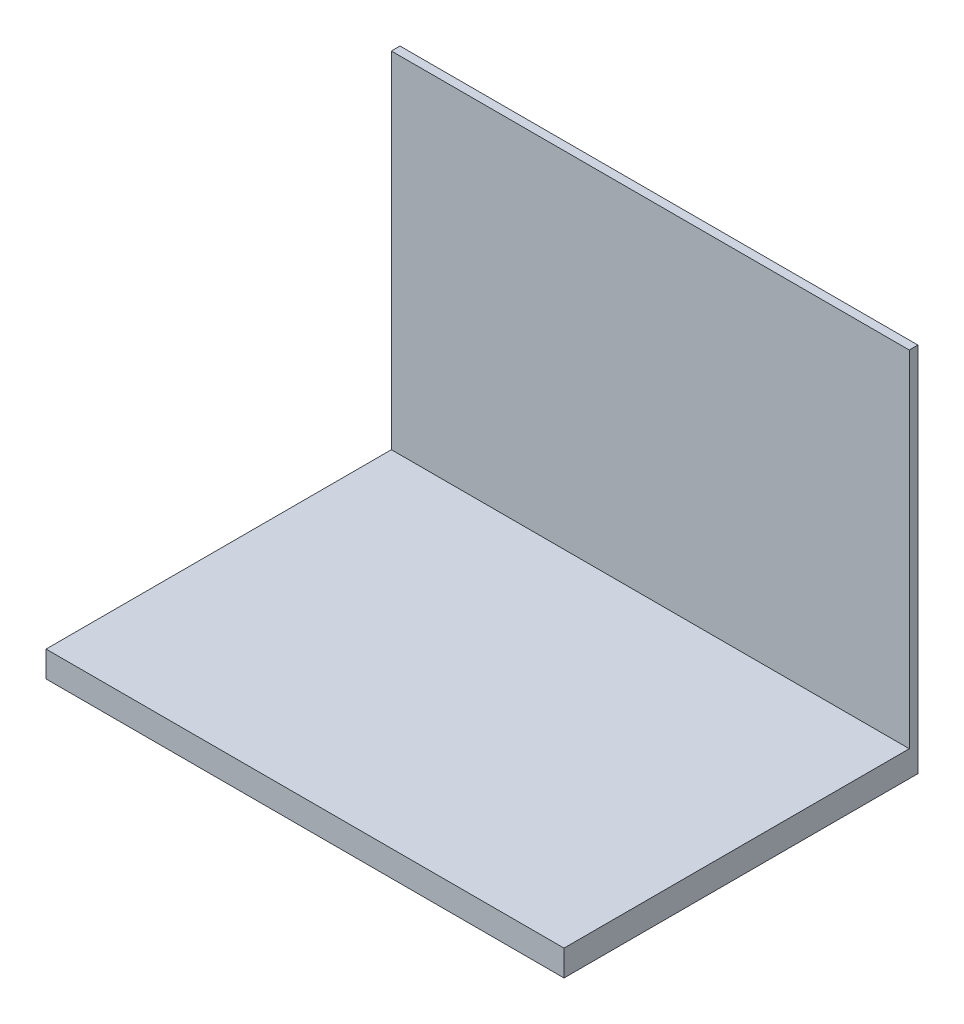
ISO-10303-21;
HEADER;
FILE_DESCRIPTION(('STEP AP214'),'2;1');
FILE_NAME('part.step','',(''),(''),'','','');
FILE_SCHEMA(('AUTOMOTIVE_DESIGN { 1 0 10303 214 1 1 1 1 }'));
ENDSEC;
DATA;
#1=APPLICATION_CONTEXT('core data for automotive mechanical design processes');
#2=APPLICATION_PROTOCOL_DEFINITION('international standard','automotive_design',2000,#1);
#3=PRODUCT_CONTEXT('',#1,'mechanical');
#4=PRODUCT('Part','Part','',(#3));
#5=PRODUCT_RELATED_PRODUCT_CATEGORY('part','',(#4));
#6=PRODUCT_DEFINITION_FORMATION('','',#4);
#7=PRODUCT_DEFINITION_CONTEXT('part definition',#1,'design');
#8=PRODUCT_DEFINITION('design','',#6,#7);
#9=PRODUCT_DEFINITION_SHAPE('','',#8);
#10=(LENGTH_UNIT() NAMED_UNIT(*) SI_UNIT(.MILLI.,.METRE.));
#11=(NAMED_UNIT(*) PLANE_ANGLE_UNIT() SI_UNIT($,.RADIAN.));
#12=(NAMED_UNIT(*) SI_UNIT($,.STERADIAN.) SOLID_ANGLE_UNIT());
#13=UNCERTAINTY_MEASURE_WITH_UNIT(LENGTH_MEASURE(1.E-05),#10,'distance_accuracy_value','');
#14=(GEOMETRIC_REPRESENTATION_CONTEXT(3) GLOBAL_UNCERTAINTY_ASSIGNED_CONTEXT((#13)) GLOBAL_UNIT_ASSIGNED_CONTEXT((#10,
#11,#12)) REPRESENTATION_CONTEXT('',''));
#15=CARTESIAN_POINT('',(0.,0.,0.));
#16=DIRECTION('',(0.,0.,1.));
#17=DIRECTION('',(1.,0.,0.));
#18=AXIS2_PLACEMENT_3D('',#15,#16,#17);
#19=CARTESIAN_POINT('',(190.5,0.,254.));
#20=DIRECTION('',(0.,-1.,0.));
#21=DIRECTION('',(0.,0.,-1.));
#22=AXIS2_PLACEMENT_3D('',#19,#20,#21);
#23=PLANE('',#22);
#24=DIRECTION('',(0.,0.,1.));
#25=VECTOR('',#24,1.);
#26=CARTESIAN_POINT('',(-190.5,0.,254.));
#27=LINE('',#26,#25);
#28=CARTESIAN_POINT('',(-190.5,0.,0.));
#29=VERTEX_POINT('',#28);
#30=CARTESIAN_POINT('',(-190.5,0.,254.));
#31=VERTEX_POINT('',#30);
#32=EDGE_CURVE('E118',#29,#31,#27,.T.);
#33=ORIENTED_EDGE('',*,*,#32,.T.);
#34=DIRECTION('',(-1.,0.,0.));
#35=VECTOR('',#34,1.);
#36=CARTESIAN_POINT('',(190.5,0.,254.));
#37=LINE('',#36,#35);
#38=CARTESIAN_POINT('',(190.5,0.,254.));
#39=VERTEX_POINT('',#38);
#40=EDGE_CURVE('E11',#39,#31,#37,.T.);
#41=ORIENTED_EDGE('',*,*,#40,.F.);
#42=DIRECTION('',(0.,0.,1.));
#43=VECTOR('',#42,1.);
#44=CARTESIAN_POINT('',(190.5,0.,254.));
#45=LINE('',#44,#43);
#46=CARTESIAN_POINT('',(190.5,0.,0.));
#47=VERTEX_POINT('',#46);
#48=EDGE_CURVE('E128',#47,#39,#45,.T.);
#49=ORIENTED_EDGE('',*,*,#48,.F.);
#50=DIRECTION('',(-1.,0.,0.));
#51=VECTOR('',#50,1.);
#52=CARTESIAN_POINT('',(190.5,0.,0.));
#53=LINE('',#52,#51);
#54=EDGE_CURVE('E114',#47,#29,#53,.T.);
#55=ORIENTED_EDGE('',*,*,#54,.T.);
#56=EDGE_LOOP('',(#33,#41,#49,#55));
#57=FACE_BOUND('',#56,.T.);
#58=ADVANCED_FACE('F34',(#57),#23,.F.);
#59=CARTESIAN_POINT('',(190.5,-19.05,254.));
#60=DIRECTION('',(0.,0.,-1.));
#61=DIRECTION('',(-1.,0.,0.));
#62=AXIS2_PLACEMENT_3D('',#59,#60,#61);
#63=PLANE('',#62);
#64=DIRECTION('',(0.,-1.,0.));
#65=VECTOR('',#64,1.);
#66=CARTESIAN_POINT('',(-190.5,-19.05,254.));
#67=LINE('',#66,#65);
#68=CARTESIAN_POINT('',(-190.5,-19.05,254.));
#69=VERTEX_POINT('',#68);
#70=EDGE_CURVE('E121',#31,#69,#67,.T.);
#71=ORIENTED_EDGE('',*,*,#70,.T.);
#72=DIRECTION('',(-1.,0.,0.));
#73=VECTOR('',#72,1.);
#74=CARTESIAN_POINT('',(190.5,-19.05,254.));
#75=LINE('',#74,#73);
#76=CARTESIAN_POINT('',(190.5,-19.05,254.));
#77=VERTEX_POINT('',#76);
#78=EDGE_CURVE('E42',#77,#69,#75,.T.);
#79=ORIENTED_EDGE('',*,*,#78,.F.);
#80=DIRECTION('',(0.,-1.,0.));
#81=VECTOR('',#80,1.);
#82=CARTESIAN_POINT('',(190.5,-19.05,254.));
#83=LINE('',#82,#81);
#84=EDGE_CURVE('E87',#39,#77,#83,.T.);
#85=ORIENTED_EDGE('',*,*,#84,.F.);
#86=ORIENTED_EDGE('',*,*,#40,.T.);
#87=EDGE_LOOP('',(#71,#79,#85,#86));
#88=FACE_BOUND('',#87,.T.);
#89=ADVANCED_FACE('F152',(#88),#63,.F.);
#90=CARTESIAN_POINT('',(190.5,-19.05,-6.3500000000001));
#91=DIRECTION('',(0.,1.,0.));
#92=DIRECTION('',(0.,0.,1.));
#93=AXIS2_PLACEMENT_3D('',#90,#91,#92);
#94=PLANE('',#93);
#95=DIRECTION('',(0.,0.,-1.));
#96=VECTOR('',#95,1.);
#97=CARTESIAN_POINT('',(-190.5,-19.05,-6.3500000000001));
#98=LINE('',#97,#96);
#99=CARTESIAN_POINT('',(-190.5,-19.05,-6.3500000000001));
#100=VERTEX_POINT('',#99);
#101=EDGE_CURVE('E123',#69,#100,#98,.T.);
#102=ORIENTED_EDGE('',*,*,#101,.T.);
#103=DIRECTION('',(-1.,0.,0.));
#104=VECTOR('',#103,1.);
#105=CARTESIAN_POINT('',(190.5,-19.05,-6.3500000000001));
#106=LINE('',#105,#104);
#107=CARTESIAN_POINT('',(190.5,-19.05,-6.3500000000001));
#108=VERTEX_POINT('',#107);
#109=EDGE_CURVE('E109',#108,#100,#106,.T.);
#110=ORIENTED_EDGE('',*,*,#109,.F.);
#111=DIRECTION('',(0.,0.,-1.));
#112=VECTOR('',#111,1.);
#113=CARTESIAN_POINT('',(190.5,-19.05,-6.3500000000001));
#114=LINE('',#113,#112);
#115=EDGE_CURVE('E100',#77,#108,#114,.T.);
#116=ORIENTED_EDGE('',*,*,#115,.F.);
#117=ORIENTED_EDGE('',*,*,#78,.T.);
#118=EDGE_LOOP('',(#102,#110,#116,#117));
#119=FACE_BOUND('',#118,.T.);
#120=ADVANCED_FACE('F134',(#119),#94,.F.);
#121=CARTESIAN_POINT('',(190.5,254.,-6.34999999999905));
#122=DIRECTION('',(0.,0.,1.));
#123=DIRECTION('',(0.,-1.,0.));
#124=AXIS2_PLACEMENT_3D('',#121,#122,#123);
#125=PLANE('',#124);
#126=DIRECTION('',(0.,1.,0.));
#127=VECTOR('',#126,1.);
#128=CARTESIAN_POINT('',(-190.5,254.,-6.34999999999905));
#129=LINE('',#128,#127);
#130=CARTESIAN_POINT('',(-190.5,254.,-6.34999999999905));
#131=VERTEX_POINT('',#130);
#132=EDGE_CURVE('E108',#100,#131,#129,.T.);
#133=ORIENTED_EDGE('',*,*,#132,.T.);
#134=DIRECTION('',(-1.,0.,0.));
#135=VECTOR('',#134,1.);
#136=CARTESIAN_POINT('',(190.5,254.,-6.34999999999905));
#137=LINE('',#136,#135);
#138=CARTESIAN_POINT('',(190.5,254.,-6.34999999999905));
#139=VERTEX_POINT('',#138);
#140=EDGE_CURVE('E105',#139,#131,#137,.T.);
#141=ORIENTED_EDGE('',*,*,#140,.F.);
#142=DIRECTION('',(0.,1.,0.));
#143=VECTOR('',#142,1.);
#144=CARTESIAN_POINT('',(190.5,254.,-6.34999999999905));
#145=LINE('',#144,#143);
#146=EDGE_CURVE('E94',#108,#139,#145,.T.);
#147=ORIENTED_EDGE('',*,*,#146,.F.);
#148=ORIENTED_EDGE('',*,*,#109,.T.);
#149=EDGE_LOOP('',(#133,#141,#147,#148));
#150=FACE_BOUND('',#149,.T.);
#151=ADVANCED_FACE('F106',(#150),#125,.F.);
#152=CARTESIAN_POINT('',(190.5,254.,9.49048317462841E-13));
#153=DIRECTION('',(0.,-1.,0.));
#154=DIRECTION('',(0.,0.,-1.));
#155=AXIS2_PLACEMENT_3D('',#152,#153,#154);
#156=PLANE('',#155);
#157=DIRECTION('',(0.,0.,1.));
#158=VECTOR('',#157,1.);
#159=CARTESIAN_POINT('',(-190.5,254.,9.49048317462841E-13));
#160=LINE('',#159,#158);
#161=CARTESIAN_POINT('',(-190.5,254.,9.49048317462841E-13));
#162=VERTEX_POINT('',#161);
#163=EDGE_CURVE('E73',#131,#162,#160,.T.);
#164=ORIENTED_EDGE('',*,*,#163,.T.);
#165=DIRECTION('',(-1.,0.,0.));
#166=VECTOR('',#165,1.);
#167=CARTESIAN_POINT('',(190.5,254.,9.49048317462841E-13));
#168=LINE('',#167,#166);
#169=CARTESIAN_POINT('',(190.5,254.,9.49048317462841E-13));
#170=VERTEX_POINT('',#169);
#171=EDGE_CURVE('E110',#170,#162,#168,.T.);
#172=ORIENTED_EDGE('',*,*,#171,.F.);
#173=DIRECTION('',(0.,0.,1.));
#174=VECTOR('',#173,1.);
#175=CARTESIAN_POINT('',(190.5,254.,9.49048317462841E-13));
#176=LINE('',#175,#174);
#177=EDGE_CURVE('E98',#139,#170,#176,.T.);
#178=ORIENTED_EDGE('',*,*,#177,.F.);
#179=ORIENTED_EDGE('',*,*,#140,.T.);
#180=EDGE_LOOP('',(#164,#172,#178,#179));
#181=FACE_BOUND('',#180,.T.);
#182=ADVANCED_FACE('F112',(#181),#156,.F.);
#183=CARTESIAN_POINT('',(190.5,0.,0.));
#184=DIRECTION('',(0.,0.,-1.));
#185=DIRECTION('',(0.,1.,0.));
#186=AXIS2_PLACEMENT_3D('',#183,#184,#185);
#187=PLANE('',#186);
#188=DIRECTION('',(0.,-1.,0.));
#189=VECTOR('',#188,1.);
#190=CARTESIAN_POINT('',(-190.5,0.,0.));
#191=LINE('',#190,#189);
#192=EDGE_CURVE('E79',#162,#29,#191,.T.);
#193=ORIENTED_EDGE('',*,*,#192,.T.);
#194=ORIENTED_EDGE('',*,*,#54,.F.);
#195=DIRECTION('',(0.,-1.,0.));
#196=VECTOR('',#195,1.);
#197=CARTESIAN_POINT('',(190.5,0.,0.));
#198=LINE('',#197,#196);
#199=EDGE_CURVE('E50',#170,#47,#198,.T.);
#200=ORIENTED_EDGE('',*,*,#199,.F.);
#201=ORIENTED_EDGE('',*,*,#171,.T.);
#202=EDGE_LOOP('',(#193,#194,#200,#201));
#203=FACE_BOUND('',#202,.T.);
#204=ADVANCED_FACE('F141',(#203),#187,.F.);
#205=CARTESIAN_POINT('',(190.5,0.,0.));
#206=DIRECTION('',(1.,0.,0.));
#207=DIRECTION('',(0.,0.,-1.));
#208=AXIS2_PLACEMENT_3D('',#205,#206,#207);
#209=PLANE('',#208);
#210=ORIENTED_EDGE('',*,*,#48,.T.);
#211=ORIENTED_EDGE('',*,*,#84,.T.);
#212=ORIENTED_EDGE('',*,*,#115,.T.);
#213=ORIENTED_EDGE('',*,*,#146,.T.);
#214=ORIENTED_EDGE('',*,*,#177,.T.);
#215=ORIENTED_EDGE('',*,*,#199,.T.);
#216=EDGE_LOOP('',(#210,#211,#212,#213,#214,#215));
#217=FACE_BOUND('',#216,.T.);
#218=ADVANCED_FACE('F96',(#217),#209,.T.);
#219=CARTESIAN_POINT('',(-190.5,0.,0.));
#220=DIRECTION('',(1.,0.,0.));
#221=DIRECTION('',(0.,0.,-1.));
#222=AXIS2_PLACEMENT_3D('',#219,#220,#221);
#223=PLANE('',#222);
#224=ORIENTED_EDGE('',*,*,#32,.F.);
#225=ORIENTED_EDGE('',*,*,#192,.F.);
#226=ORIENTED_EDGE('',*,*,#163,.F.);
#227=ORIENTED_EDGE('',*,*,#132,.F.);
#228=ORIENTED_EDGE('',*,*,#101,.F.);
#229=ORIENTED_EDGE('',*,*,#70,.F.);
#230=EDGE_LOOP('',(#224,#225,#226,#227,#228,#229));
#231=FACE_BOUND('',#230,.T.);
#232=ADVANCED_FACE('F137',(#231),#223,.F.);
#233=CLOSED_SHELL('',(#58,#89,#120,#151,#182,#204,#218,#232));
#234=MANIFOLD_SOLID_BREP('B2',#233);
#235=ADVANCED_BREP_SHAPE_REPRESENTATION('',(#18,#234),#14);
#236=SHAPE_DEFINITION_REPRESENTATION(#9,#235);
ENDSEC;
END-ISO-10303-21;
